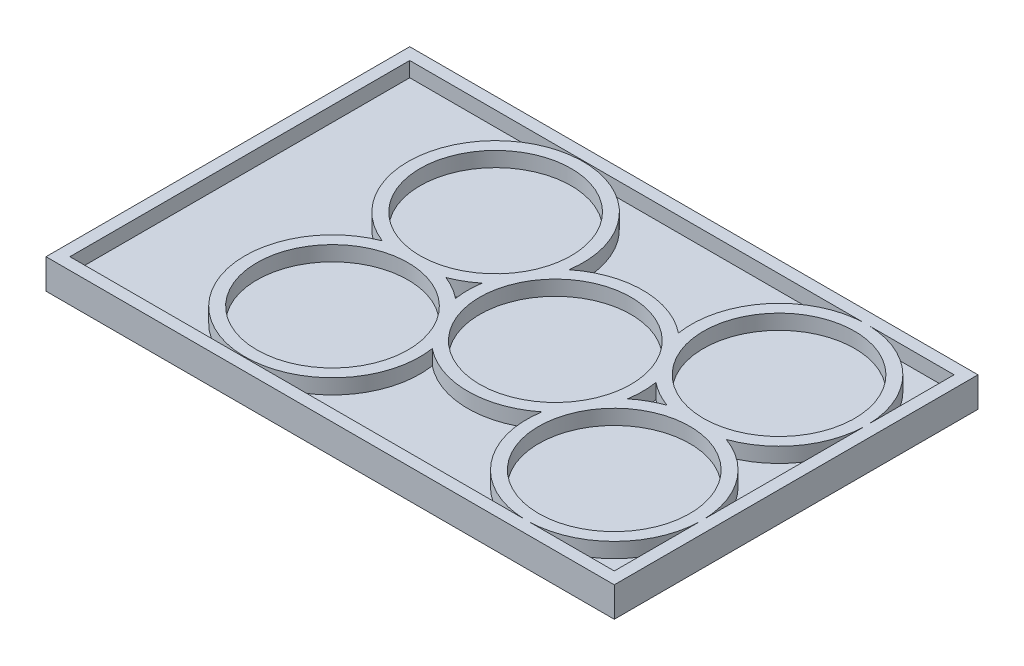
ISO-10303-21;
HEADER;
FILE_DESCRIPTION(('STEP AP214'),'2;1');
FILE_NAME('part.step','',(''),(''),'','','');
FILE_SCHEMA(('AUTOMOTIVE_DESIGN { 1 0 10303 214 1 1 1 1 }'));
ENDSEC;
DATA;
#1=APPLICATION_CONTEXT('core data for automotive mechanical design processes');
#2=APPLICATION_PROTOCOL_DEFINITION('international standard','automotive_design',2000,#1);
#3=PRODUCT_CONTEXT('',#1,'mechanical');
#4=PRODUCT('Part','Part','',(#3));
#5=PRODUCT_RELATED_PRODUCT_CATEGORY('part','',(#4));
#6=PRODUCT_DEFINITION_FORMATION('','',#4);
#7=PRODUCT_DEFINITION_CONTEXT('part definition',#1,'design');
#8=PRODUCT_DEFINITION('design','',#6,#7);
#9=PRODUCT_DEFINITION_SHAPE('','',#8);
#10=(LENGTH_UNIT() NAMED_UNIT(*) SI_UNIT(.MILLI.,.METRE.));
#11=(NAMED_UNIT(*) PLANE_ANGLE_UNIT() SI_UNIT($,.RADIAN.));
#12=(NAMED_UNIT(*) SI_UNIT($,.STERADIAN.) SOLID_ANGLE_UNIT());
#13=UNCERTAINTY_MEASURE_WITH_UNIT(LENGTH_MEASURE(1.E-05),#10,'distance_accuracy_value','');
#14=(GEOMETRIC_REPRESENTATION_CONTEXT(3) GLOBAL_UNCERTAINTY_ASSIGNED_CONTEXT((#13)) GLOBAL_UNIT_ASSIGNED_CONTEXT((#10,
#11,#12)) REPRESENTATION_CONTEXT('',''));
#15=CARTESIAN_POINT('',(0.,0.,0.));
#16=DIRECTION('',(0.,0.,1.));
#17=DIRECTION('',(1.,0.,0.));
#18=AXIS2_PLACEMENT_3D('',#15,#16,#17);
#19=CARTESIAN_POINT('',(0.,2.,0.));
#20=DIRECTION('',(0.,1.,0.));
#21=DIRECTION('',(0.,0.,1.));
#22=AXIS2_PLACEMENT_3D('',#19,#20,#21);
#23=PLANE('',#22);
#24=CARTESIAN_POINT('',(19.5261812499949,2.,-4.37217246100147));
#25=DIRECTION('',(0.,1.,0.));
#26=DIRECTION('',(0.,0.,1.));
#27=AXIS2_PLACEMENT_3D('',#24,#25,#26);
#28=CIRCLE('',#27,11.715);
#29=CARTESIAN_POINT('',(31.2361812499949,2.,-4.71440776017445));
#30=VERTEX_POINT('',#29);
#31=CARTESIAN_POINT('',(23.4873174506323,2.,-15.3971724610015));
#32=VERTEX_POINT('',#31);
#33=EDGE_CURVE('E319',#30,#32,#28,.T.);
#34=ORIENTED_EDGE('',*,*,#33,.F.);
#35=DIRECTION('',(0.,0.,1.));
#36=VECTOR('',#35,1.);
#37=CARTESIAN_POINT('',(31.2361812499949,2.,0.));
#38=LINE('',#37,#36);
#39=CARTESIAN_POINT('',(31.2361812499949,2.,-26.0799371618285));
#40=VERTEX_POINT('',#39);
#41=EDGE_CURVE('E301',#40,#30,#38,.T.);
#42=ORIENTED_EDGE('',*,*,#41,.F.);
#43=CARTESIAN_POINT('',(19.5261812499949,2.,-26.4221724610015));
#44=DIRECTION('',(0.,1.,0.));
#45=DIRECTION('',(0.,0.,1.));
#46=AXIS2_PLACEMENT_3D('',#43,#44,#45);
#47=CIRCLE('',#46,11.715);
#48=EDGE_CURVE('E379',#32,#40,#47,.T.);
#49=ORIENTED_EDGE('',*,*,#48,.F.);
#50=EDGE_LOOP('',(#34,#42,#49));
#51=FACE_BOUND('',#50,.T.);
#52=ADVANCED_FACE('F45',(#51),#23,.T.);
#53=CARTESIAN_POINT('',(31.2361812499949,2.,-38.1321724610015));
#54=VERTEX_POINT('',#53);
#55=CARTESIAN_POINT('',(31.2361812499949,2.,-26.7644077601744));
#56=VERTEX_POINT('',#55);
#57=EDGE_CURVE('E61',#54,#56,#38,.T.);
#58=ORIENTED_EDGE('',*,*,#57,.F.);
#59=DIRECTION('',(1.,0.,0.));
#60=VECTOR('',#59,1.);
#61=CARTESIAN_POINT('',(0.,2.,-38.1321724610015));
#62=LINE('',#61,#60);
#63=CARTESIAN_POINT('',(19.8684165491677,2.,-38.1321724610015));
#64=VERTEX_POINT('',#63);
#65=EDGE_CURVE('E298',#64,#54,#62,.T.);
#66=ORIENTED_EDGE('',*,*,#65,.F.);
#67=EDGE_CURVE('E385',#56,#64,#47,.T.);
#68=ORIENTED_EDGE('',*,*,#67,.F.);
#69=EDGE_LOOP('',(#58,#66,#68));
#70=FACE_BOUND('',#69,.T.);
#71=ADVANCED_FACE('F536',(#70),#23,.T.);
#72=DIRECTION('',(1.,0.,0.));
#73=VECTOR('',#72,1.);
#74=CARTESIAN_POINT('',(0.,2.,7.33782753899853));
#75=LINE('',#74,#73);
#76=CARTESIAN_POINT('',(19.8684165491679,2.,7.33782753899853));
#77=VERTEX_POINT('',#76);
#78=CARTESIAN_POINT('',(31.2361812499949,2.,7.33782753899853));
#79=VERTEX_POINT('',#78);
#80=EDGE_CURVE('E69',#77,#79,#75,.T.);
#81=ORIENTED_EDGE('',*,*,#80,.T.);
#82=CARTESIAN_POINT('',(31.2361812499949,2.,-4.0299371618285));
#83=VERTEX_POINT('',#82);
#84=EDGE_CURVE('E297',#83,#79,#38,.T.);
#85=ORIENTED_EDGE('',*,*,#84,.F.);
#86=EDGE_CURVE('E567',#77,#83,#28,.T.);
#87=ORIENTED_EDGE('',*,*,#86,.F.);
#88=EDGE_LOOP('',(#81,#85,#87));
#89=FACE_BOUND('',#88,.T.);
#90=ADVANCED_FACE('F542',(#89),#23,.T.);
#91=CARTESIAN_POINT('',(19.183945950822,2.,-38.1321724610015));
#92=VERTEX_POINT('',#91);
#93=CARTESIAN_POINT('',(7.96686366574245,2.,-24.5186488897283));
#94=VERTEX_POINT('',#93);
#95=EDGE_CURVE('E391',#92,#94,#47,.T.);
#96=ORIENTED_EDGE('',*,*,#95,.F.);
#97=CARTESIAN_POINT('',(-41.6038187500051,2.,-38.1321724610015));
#98=VERTEX_POINT('',#97);
#99=EDGE_CURVE('E293',#98,#92,#62,.T.);
#100=ORIENTED_EDGE('',*,*,#99,.F.);
#101=DIRECTION('',(0.,0.,1.));
#102=VECTOR('',#101,1.);
#103=CARTESIAN_POINT('',(-41.6038187500051,2.,0.));
#104=LINE('',#103,#102);
#105=CARTESIAN_POINT('',(-41.6038187500051,2.,7.33782753899853));
#106=VERTEX_POINT('',#105);
#107=EDGE_CURVE('E262',#98,#106,#104,.T.);
#108=ORIENTED_EDGE('',*,*,#107,.T.);
#109=CARTESIAN_POINT('',(19.1839459508219,2.,7.33782753899853));
#110=VERTEX_POINT('',#109);
#111=EDGE_CURVE('E265',#106,#110,#75,.T.);
#112=ORIENTED_EDGE('',*,*,#111,.T.);
#113=CARTESIAN_POINT('',(7.96686366574245,2.,-6.27569603227465));
#114=VERTEX_POINT('',#113);
#115=EDGE_CURVE('E381',#114,#110,#28,.T.);
#116=ORIENTED_EDGE('',*,*,#115,.F.);
#117=CARTESIAN_POINT('',(0.615680579994879,2.,-15.3971724610015));
#118=DIRECTION('',(0.,1.,0.));
#119=DIRECTION('',(0.,0.,1.));
#120=AXIS2_PLACEMENT_3D('',#117,#118,#119);
#121=CIRCLE('',#120,11.715);
#122=CARTESIAN_POINT('',(-6.70954692643147,2.,-6.25483867913292));
#123=VERTEX_POINT('',#122);
#124=EDGE_CURVE('E393',#123,#114,#121,.T.);
#125=ORIENTED_EDGE('',*,*,#124,.F.);
#126=CARTESIAN_POINT('',(-18.2896539846195,2.,-4.48217246100158));
#127=DIRECTION('',(0.,1.,0.));
#128=DIRECTION('',(0.,0.,1.));
#129=AXIS2_PLACEMENT_3D('',#126,#127,#128);
#130=CIRCLE('',#129,11.715);
#131=CARTESIAN_POINT('',(-22.5445335363815,2.,-15.3971724610015));
#132=VERTEX_POINT('',#131);
#133=EDGE_CURVE('E396',#132,#123,#130,.T.);
#134=ORIENTED_EDGE('',*,*,#133,.F.);
#135=CARTESIAN_POINT('',(-18.2896539846195,2.,-26.3121724610014));
#136=DIRECTION('',(0.,1.,0.));
#137=DIRECTION('',(0.,0.,1.));
#138=AXIS2_PLACEMENT_3D('',#135,#136,#137);
#139=CIRCLE('',#138,11.715);
#140=CARTESIAN_POINT('',(-6.70954692643146,2.,-24.53950624287));
#141=VERTEX_POINT('',#140);
#142=EDGE_CURVE('E390',#141,#132,#139,.T.);
#143=ORIENTED_EDGE('',*,*,#142,.F.);
#144=EDGE_CURVE('E387',#94,#141,#121,.T.);
#145=ORIENTED_EDGE('',*,*,#144,.F.);
#146=EDGE_LOOP('',(#96,#100,#108,#112,#116,#125,#134,#143,#145));
#147=FACE_BOUND('',#146,.T.);
#148=ADVANCED_FACE('F534',(#147),#23,.T.);
#149=CARTESIAN_POINT('',(0.615680579994879,4.,-15.3971724610015));
#150=DIRECTION('',(0.,-1.,0.));
#151=DIRECTION('',(0.,0.,-1.));
#152=AXIS2_PLACEMENT_3D('',#149,#150,#151);
#153=CYLINDRICAL_SURFACE('',#152,11.715);
#154=CARTESIAN_POINT('',(0.615680579994879,2.,-15.3971724610015));
#155=DIRECTION('',(0.,1.,0.));
#156=DIRECTION('',(0.,0.,1.));
#157=AXIS2_PLACEMENT_3D('',#154,#155,#156);
#158=CIRCLE('',#157,11.715);
#159=CARTESIAN_POINT('',(-10.9644264781931,2.,-17.1698386791328));
#160=VERTEX_POINT('',#159);
#161=CARTESIAN_POINT('',(-10.9644264781931,2.,-13.6245062428701));
#162=VERTEX_POINT('',#161);
#163=EDGE_CURVE('E399',#160,#162,#158,.T.);
#164=ORIENTED_EDGE('',*,*,#163,.T.);
#165=DIRECTION('',(0.,-1.,0.));
#166=VECTOR('',#165,1.);
#167=CARTESIAN_POINT('',(-10.9644264781931,4.,-13.6245062428701));
#168=LINE('',#167,#166);
#169=CARTESIAN_POINT('',(-10.9644264781931,4.,-13.6245062428701));
#170=VERTEX_POINT('',#169);
#171=EDGE_CURVE('E417',#170,#162,#168,.T.);
#172=ORIENTED_EDGE('',*,*,#171,.F.);
#173=CARTESIAN_POINT('',(0.615680579994879,4.,-15.3971724610015));
#174=DIRECTION('',(0.,1.,0.));
#175=DIRECTION('',(0.,0.,1.));
#176=AXIS2_PLACEMENT_3D('',#173,#174,#175);
#177=CIRCLE('',#176,11.715);
#178=CARTESIAN_POINT('',(-10.9644264781931,4.,-17.1698386791328));
#179=VERTEX_POINT('',#178);
#180=EDGE_CURVE('E357',#179,#170,#177,.T.);
#181=ORIENTED_EDGE('',*,*,#180,.F.);
#182=DIRECTION('',(0.,-1.,0.));
#183=VECTOR('',#182,1.);
#184=CARTESIAN_POINT('',(-10.9644264781931,4.,-17.1698386791328));
#185=LINE('',#184,#183);
#186=EDGE_CURVE('E409',#179,#160,#185,.T.);
#187=ORIENTED_EDGE('',*,*,#186,.T.);
#188=EDGE_LOOP('',(#164,#172,#181,#187));
#189=FACE_BOUND('',#188,.T.);
#190=ADVANCED_FACE('F682',(#189),#153,.T.);
#191=CARTESIAN_POINT('',(-18.2896539846195,4.,-4.48217246100158));
#192=DIRECTION('',(0.,-1.,0.));
#193=DIRECTION('',(0.,0.,-1.));
#194=AXIS2_PLACEMENT_3D('',#191,#192,#193);
#195=CYLINDRICAL_SURFACE('',#194,11.715);
#196=CARTESIAN_POINT('',(-18.2896539846195,2.,-4.48217246100158));
#197=DIRECTION('',(0.,1.,0.));
#198=DIRECTION('',(0.,0.,1.));
#199=AXIS2_PLACEMENT_3D('',#196,#197,#198);
#200=CIRCLE('',#199,11.715);
#201=CARTESIAN_POINT('',(-14.0347744328575,2.,-15.3971724610015));
#202=VERTEX_POINT('',#201);
#203=EDGE_CURVE('E403',#162,#202,#200,.T.);
#204=ORIENTED_EDGE('',*,*,#203,.T.);
#205=DIRECTION('',(0.,-1.,0.));
#206=VECTOR('',#205,1.);
#207=CARTESIAN_POINT('',(-14.0347744328575,4.,-15.3971724610015));
#208=LINE('',#207,#206);
#209=CARTESIAN_POINT('',(-14.0347744328575,4.,-15.3971724610015));
#210=VERTEX_POINT('',#209);
#211=EDGE_CURVE('E413',#210,#202,#208,.T.);
#212=ORIENTED_EDGE('',*,*,#211,.F.);
#213=CARTESIAN_POINT('',(-18.2896539846195,4.,-4.48217246100158));
#214=DIRECTION('',(0.,1.,0.));
#215=DIRECTION('',(0.,0.,1.));
#216=AXIS2_PLACEMENT_3D('',#213,#214,#215);
#217=CIRCLE('',#216,11.715);
#218=EDGE_CURVE('E361',#170,#210,#217,.T.);
#219=ORIENTED_EDGE('',*,*,#218,.F.);
#220=ORIENTED_EDGE('',*,*,#171,.T.);
#221=EDGE_LOOP('',(#204,#212,#219,#220));
#222=FACE_BOUND('',#221,.T.);
#223=ADVANCED_FACE('F665',(#222),#195,.T.);
#224=CARTESIAN_POINT('',(19.5261812499949,4.,-26.4221724610015));
#225=DIRECTION('',(0.,-1.,0.));
#226=DIRECTION('',(0.,0.,-1.));
#227=AXIS2_PLACEMENT_3D('',#224,#225,#226);
#228=CYLINDRICAL_SURFACE('',#227,11.715);
#229=CARTESIAN_POINT('',(12.1749981642473,2.,-17.3006960322747));
#230=VERTEX_POINT('',#229);
#231=CARTESIAN_POINT('',(15.5650450493575,2.,-15.3971724610015));
#232=VERTEX_POINT('',#231);
#233=EDGE_CURVE('E386',#230,#232,#47,.T.);
#234=ORIENTED_EDGE('',*,*,#233,.T.);
#235=DIRECTION('',(0.,-1.,0.));
#236=VECTOR('',#235,1.);
#237=CARTESIAN_POINT('',(15.5650450493575,4.,-15.3971724610015));
#238=LINE('',#237,#236);
#239=CARTESIAN_POINT('',(15.5650450493575,4.,-15.3971724610015));
#240=VERTEX_POINT('',#239);
#241=EDGE_CURVE('E414',#240,#232,#238,.T.);
#242=ORIENTED_EDGE('',*,*,#241,.F.);
#243=CARTESIAN_POINT('',(19.5261812499949,4.,-26.4221724610015));
#244=DIRECTION('',(0.,1.,0.));
#245=DIRECTION('',(0.,0.,1.));
#246=AXIS2_PLACEMENT_3D('',#243,#244,#245);
#247=CIRCLE('',#246,11.715);
#248=CARTESIAN_POINT('',(12.1749981642473,4.,-17.3006960322747));
#249=VERTEX_POINT('',#248);
#250=EDGE_CURVE('E331',#249,#240,#247,.T.);
#251=ORIENTED_EDGE('',*,*,#250,.F.);
#252=DIRECTION('',(0.,-1.,0.));
#253=VECTOR('',#252,1.);
#254=CARTESIAN_POINT('',(12.1749981642473,4.,-17.3006960322747));
#255=LINE('',#254,#253);
#256=EDGE_CURVE('E421',#249,#230,#255,.T.);
#257=ORIENTED_EDGE('',*,*,#256,.T.);
#258=EDGE_LOOP('',(#234,#242,#251,#257));
#259=FACE_BOUND('',#258,.T.);
#260=ADVANCED_FACE('F661',(#259),#228,.T.);
#261=CARTESIAN_POINT('',(19.5261812499949,4.,-4.37217246100147));
#262=DIRECTION('',(0.,-1.,0.));
#263=DIRECTION('',(0.,0.,-1.));
#264=AXIS2_PLACEMENT_3D('',#261,#262,#263);
#265=CYLINDRICAL_SURFACE('',#264,11.715);
#266=CARTESIAN_POINT('',(12.1749981642473,2.,-13.4936488897283));
#267=VERTEX_POINT('',#266);
#268=EDGE_CURVE('E380',#232,#267,#28,.T.);
#269=ORIENTED_EDGE('',*,*,#268,.T.);
#270=DIRECTION('',(0.,-1.,0.));
#271=VECTOR('',#270,1.);
#272=CARTESIAN_POINT('',(12.1749981642473,4.,-13.4936488897283));
#273=LINE('',#272,#271);
#274=CARTESIAN_POINT('',(12.1749981642473,4.,-13.4936488897283));
#275=VERTEX_POINT('',#274);
#276=EDGE_CURVE('E425',#275,#267,#273,.T.);
#277=ORIENTED_EDGE('',*,*,#276,.F.);
#278=CARTESIAN_POINT('',(19.5261812499949,4.,-4.37217246100147));
#279=DIRECTION('',(0.,1.,0.));
#280=DIRECTION('',(0.,0.,1.));
#281=AXIS2_PLACEMENT_3D('',#278,#279,#280);
#282=CIRCLE('',#281,11.715);
#283=EDGE_CURVE('E326',#240,#275,#282,.T.);
#284=ORIENTED_EDGE('',*,*,#283,.F.);
#285=ORIENTED_EDGE('',*,*,#241,.T.);
#286=EDGE_LOOP('',(#269,#277,#284,#285));
#287=FACE_BOUND('',#286,.T.);
#288=ADVANCED_FACE('F664',(#287),#265,.T.);
#289=ORIENTED_EDGE('',*,*,#33,.T.);
#290=DIRECTION('',(0.,-1.,0.));
#291=VECTOR('',#290,1.);
#292=CARTESIAN_POINT('',(23.4873174506323,4.,-15.3971724610015));
#293=LINE('',#292,#291);
#294=CARTESIAN_POINT('',(23.4873174506323,4.,-15.3971724610015));
#295=VERTEX_POINT('',#294);
#296=EDGE_CURVE('E426',#295,#32,#293,.T.);
#297=ORIENTED_EDGE('',*,*,#296,.F.);
#298=CARTESIAN_POINT('',(31.2361812499949,4.,-4.71440776017445));
#299=VERTEX_POINT('',#298);
#300=EDGE_CURVE('E320',#299,#295,#282,.T.);
#301=ORIENTED_EDGE('',*,*,#300,.F.);
#302=DIRECTION('',(0.,-1.,0.));
#303=VECTOR('',#302,1.);
#304=CARTESIAN_POINT('',(31.2361812499949,4.,-4.71440776017445));
#305=LINE('',#304,#303);
#306=EDGE_CURVE('E375',#299,#30,#305,.T.);
#307=ORIENTED_EDGE('',*,*,#306,.T.);
#308=EDGE_LOOP('',(#289,#297,#301,#307));
#309=FACE_BOUND('',#308,.T.);
#310=ADVANCED_FACE('F669',(#309),#265,.T.);
#311=ORIENTED_EDGE('',*,*,#48,.T.);
#312=DIRECTION('',(0.,-1.,0.));
#313=VECTOR('',#312,1.);
#314=CARTESIAN_POINT('',(31.2361812499949,4.,-26.0799371618285));
#315=LINE('',#314,#313);
#316=CARTESIAN_POINT('',(31.2361812499949,4.,-26.0799371618285));
#317=VERTEX_POINT('',#316);
#318=EDGE_CURVE('E474',#317,#40,#315,.T.);
#319=ORIENTED_EDGE('',*,*,#318,.F.);
#320=EDGE_CURVE('E324',#295,#317,#247,.T.);
#321=ORIENTED_EDGE('',*,*,#320,.F.);
#322=ORIENTED_EDGE('',*,*,#296,.T.);
#323=EDGE_LOOP('',(#311,#319,#321,#322));
#324=FACE_BOUND('',#323,.T.);
#325=ADVANCED_FACE('F667',(#324),#228,.T.);
#326=ORIENTED_EDGE('',*,*,#67,.T.);
#327=DIRECTION('',(0.,-1.,0.));
#328=VECTOR('',#327,1.);
#329=CARTESIAN_POINT('',(19.8684165491677,4.,-38.1321724610015));
#330=LINE('',#329,#328);
#331=CARTESIAN_POINT('',(19.8684165491677,4.,-38.1321724610015));
#332=VERTEX_POINT('',#331);
#333=EDGE_CURVE('E467',#332,#64,#330,.T.);
#334=ORIENTED_EDGE('',*,*,#333,.F.);
#335=CARTESIAN_POINT('',(31.2361812499949,4.,-26.7644077601744));
#336=VERTEX_POINT('',#335);
#337=EDGE_CURVE('E330',#336,#332,#247,.T.);
#338=ORIENTED_EDGE('',*,*,#337,.F.);
#339=DIRECTION('',(0.,-1.,0.));
#340=VECTOR('',#339,1.);
#341=CARTESIAN_POINT('',(31.2361812499949,4.,-26.7644077601744));
#342=LINE('',#341,#340);
#343=EDGE_CURVE('E471',#336,#56,#342,.T.);
#344=ORIENTED_EDGE('',*,*,#343,.T.);
#345=EDGE_LOOP('',(#326,#334,#338,#344));
#346=FACE_BOUND('',#345,.T.);
#347=ADVANCED_FACE('F621',(#346),#228,.T.);
#348=ORIENTED_EDGE('',*,*,#95,.T.);
#349=DIRECTION('',(0.,-1.,0.));
#350=VECTOR('',#349,1.);
#351=CARTESIAN_POINT('',(7.96686366574245,4.,-24.5186488897283));
#352=LINE('',#351,#350);
#353=CARTESIAN_POINT('',(7.96686366574245,4.,-24.5186488897283));
#354=VERTEX_POINT('',#353);
#355=EDGE_CURVE('E460',#354,#94,#352,.T.);
#356=ORIENTED_EDGE('',*,*,#355,.F.);
#357=CARTESIAN_POINT('',(19.183945950822,4.,-38.1321724610015));
#358=VERTEX_POINT('',#357);
#359=EDGE_CURVE('E336',#358,#354,#247,.T.);
#360=ORIENTED_EDGE('',*,*,#359,.F.);
#361=DIRECTION('',(0.,-1.,0.));
#362=VECTOR('',#361,1.);
#363=CARTESIAN_POINT('',(19.183945950822,4.,-38.1321724610015));
#364=LINE('',#363,#362);
#365=EDGE_CURVE('E464',#358,#92,#364,.T.);
#366=ORIENTED_EDGE('',*,*,#365,.T.);
#367=EDGE_LOOP('',(#348,#356,#360,#366));
#368=FACE_BOUND('',#367,.T.);
#369=ADVANCED_FACE('F633',(#368),#228,.T.);
#370=CARTESIAN_POINT('',(0.615680579994879,4.,-15.3971724610015));
#371=DIRECTION('',(0.,-1.,0.));
#372=DIRECTION('',(0.,0.,-1.));
#373=AXIS2_PLACEMENT_3D('',#370,#371,#372);
#374=CYLINDRICAL_SURFACE('',#373,11.715);
#375=ORIENTED_EDGE('',*,*,#144,.T.);
#376=DIRECTION('',(0.,-1.,0.));
#377=VECTOR('',#376,1.);
#378=CARTESIAN_POINT('',(-6.70954692643146,4.,-24.53950624287));
#379=LINE('',#378,#377);
#380=CARTESIAN_POINT('',(-6.70954692643146,4.,-24.53950624287));
#381=VERTEX_POINT('',#380);
#382=EDGE_CURVE('E456',#381,#141,#379,.T.);
#383=ORIENTED_EDGE('',*,*,#382,.F.);
#384=CARTESIAN_POINT('',(0.615680579994879,4.,-15.3971724610015));
#385=DIRECTION('',(0.,1.,0.));
#386=DIRECTION('',(0.,0.,1.));
#387=AXIS2_PLACEMENT_3D('',#384,#385,#386);
#388=CIRCLE('',#387,11.715);
#389=EDGE_CURVE('E332',#354,#381,#388,.T.);
#390=ORIENTED_EDGE('',*,*,#389,.F.);
#391=ORIENTED_EDGE('',*,*,#355,.T.);
#392=EDGE_LOOP('',(#375,#383,#390,#391));
#393=FACE_BOUND('',#392,.T.);
#394=ADVANCED_FACE('F638',(#393),#374,.T.);
#395=CARTESIAN_POINT('',(-18.2896539846195,4.,-26.3121724610014));
#396=DIRECTION('',(0.,-1.,0.));
#397=DIRECTION('',(0.,0.,-1.));
#398=AXIS2_PLACEMENT_3D('',#395,#396,#397);
#399=CYLINDRICAL_SURFACE('',#398,11.715);
#400=ORIENTED_EDGE('',*,*,#142,.T.);
#401=DIRECTION('',(0.,-1.,0.));
#402=VECTOR('',#401,1.);
#403=CARTESIAN_POINT('',(-22.5445335363815,4.,-15.3971724610015));
#404=LINE('',#403,#402);
#405=CARTESIAN_POINT('',(-22.5445335363815,4.,-15.3971724610015));
#406=VERTEX_POINT('',#405);
#407=EDGE_CURVE('E452',#406,#132,#404,.T.);
#408=ORIENTED_EDGE('',*,*,#407,.F.);
#409=CARTESIAN_POINT('',(-18.2896539846195,4.,-26.3121724610014));
#410=DIRECTION('',(0.,1.,0.));
#411=DIRECTION('',(0.,0.,1.));
#412=AXIS2_PLACEMENT_3D('',#409,#410,#411);
#413=CIRCLE('',#412,11.715);
#414=EDGE_CURVE('E335',#381,#406,#413,.T.);
#415=ORIENTED_EDGE('',*,*,#414,.F.);
#416=ORIENTED_EDGE('',*,*,#382,.T.);
#417=EDGE_LOOP('',(#400,#408,#415,#416));
#418=FACE_BOUND('',#417,.T.);
#419=ADVANCED_FACE('F643',(#418),#399,.T.);
#420=CARTESIAN_POINT('',(-18.2896539846195,4.,-4.48217246100158));
#421=DIRECTION('',(0.,-1.,0.));
#422=DIRECTION('',(0.,0.,-1.));
#423=AXIS2_PLACEMENT_3D('',#420,#421,#422);
#424=CYLINDRICAL_SURFACE('',#423,11.715);
#425=ORIENTED_EDGE('',*,*,#133,.T.);
#426=DIRECTION('',(0.,-1.,0.));
#427=VECTOR('',#426,1.);
#428=CARTESIAN_POINT('',(-6.70954692643147,4.,-6.25483867913292));
#429=LINE('',#428,#427);
#430=CARTESIAN_POINT('',(-6.70954692643147,4.,-6.25483867913292));
#431=VERTEX_POINT('',#430);
#432=EDGE_CURVE('E448',#431,#123,#429,.T.);
#433=ORIENTED_EDGE('',*,*,#432,.F.);
#434=CARTESIAN_POINT('',(-18.2896539846195,4.,-4.48217246100158));
#435=DIRECTION('',(0.,1.,0.));
#436=DIRECTION('',(0.,0.,1.));
#437=AXIS2_PLACEMENT_3D('',#434,#435,#436);
#438=CIRCLE('',#437,11.715);
#439=EDGE_CURVE('E341',#406,#431,#438,.T.);
#440=ORIENTED_EDGE('',*,*,#439,.F.);
#441=ORIENTED_EDGE('',*,*,#407,.T.);
#442=EDGE_LOOP('',(#425,#433,#440,#441));
#443=FACE_BOUND('',#442,.T.);
#444=ADVANCED_FACE('F647',(#443),#424,.T.);
#445=ORIENTED_EDGE('',*,*,#124,.T.);
#446=DIRECTION('',(0.,-1.,0.));
#447=VECTOR('',#446,1.);
#448=CARTESIAN_POINT('',(7.96686366574245,4.,-6.27569603227465));
#449=LINE('',#448,#447);
#450=CARTESIAN_POINT('',(7.96686366574245,4.,-6.27569603227465));
#451=VERTEX_POINT('',#450);
#452=EDGE_CURVE('E444',#451,#114,#449,.T.);
#453=ORIENTED_EDGE('',*,*,#452,.F.);
#454=EDGE_CURVE('E338',#431,#451,#388,.T.);
#455=ORIENTED_EDGE('',*,*,#454,.F.);
#456=ORIENTED_EDGE('',*,*,#432,.T.);
#457=EDGE_LOOP('',(#445,#453,#455,#456));
#458=FACE_BOUND('',#457,.T.);
#459=ADVANCED_FACE('F582',(#458),#374,.T.);
#460=ORIENTED_EDGE('',*,*,#115,.T.);
#461=DIRECTION('',(0.,-1.,0.));
#462=VECTOR('',#461,1.);
#463=CARTESIAN_POINT('',(19.1839459508219,4.,7.33782753899853));
#464=LINE('',#463,#462);
#465=CARTESIAN_POINT('',(19.1839459508219,4.,7.33782753899853));
#466=VERTEX_POINT('',#465);
#467=EDGE_CURVE('E440',#466,#110,#464,.T.);
#468=ORIENTED_EDGE('',*,*,#467,.F.);
#469=EDGE_CURVE('E327',#451,#466,#282,.T.);
#470=ORIENTED_EDGE('',*,*,#469,.F.);
#471=ORIENTED_EDGE('',*,*,#452,.T.);
#472=EDGE_LOOP('',(#460,#468,#470,#471));
#473=FACE_BOUND('',#472,.T.);
#474=ADVANCED_FACE('F588',(#473),#265,.T.);
#475=ORIENTED_EDGE('',*,*,#86,.T.);
#476=DIRECTION('',(0.,-1.,0.));
#477=VECTOR('',#476,1.);
#478=CARTESIAN_POINT('',(31.2361812499949,4.,-4.0299371618285));
#479=LINE('',#478,#477);
#480=CARTESIAN_POINT('',(31.2361812499949,4.,-4.0299371618285));
#481=VERTEX_POINT('',#480);
#482=EDGE_CURVE('E433',#481,#83,#479,.T.);
#483=ORIENTED_EDGE('',*,*,#482,.F.);
#484=CARTESIAN_POINT('',(19.8684165491679,4.,7.33782753899853));
#485=VERTEX_POINT('',#484);
#486=EDGE_CURVE('E348',#485,#481,#282,.T.);
#487=ORIENTED_EDGE('',*,*,#486,.F.);
#488=DIRECTION('',(0.,-1.,0.));
#489=VECTOR('',#488,1.);
#490=CARTESIAN_POINT('',(19.8684165491679,4.,7.33782753899853));
#491=LINE('',#490,#489);
#492=EDGE_CURVE('E437',#485,#77,#491,.T.);
#493=ORIENTED_EDGE('',*,*,#492,.T.);
#494=EDGE_LOOP('',(#475,#483,#487,#493));
#495=FACE_BOUND('',#494,.T.);
#496=ADVANCED_FACE('F670',(#495),#265,.T.);
#497=CARTESIAN_POINT('',(19.5261812499949,4.,-26.4221724610015));
#498=DIRECTION('',(0.,-1.,0.));
#499=DIRECTION('',(0.,0.,-1.));
#500=AXIS2_PLACEMENT_3D('',#497,#498,#499);
#501=CYLINDRICAL_SURFACE('',#500,10.115);
#502=CARTESIAN_POINT('',(19.5261812499949,4.,-26.4221724610015));
#503=DIRECTION('',(0.,1.,0.));
#504=DIRECTION('',(0.,0.,1.));
#505=AXIS2_PLACEMENT_3D('',#502,#503,#504);
#506=CIRCLE('',#505,10.115);
#507=CARTESIAN_POINT('',(19.5261812499949,4.,-16.3071724610015));
#508=VERTEX_POINT('',#507);
#509=EDGE_CURVE('E367',#508,#508,#506,.T.);
#510=ORIENTED_EDGE('',*,*,#509,.T.);
#511=EDGE_LOOP('',(#510));
#512=FACE_BOUND('',#511,.T.);
#513=CARTESIAN_POINT('',(19.5261812499949,2.,-26.4221724610015));
#514=DIRECTION('',(0.,1.,0.));
#515=DIRECTION('',(0.,0.,1.));
#516=AXIS2_PLACEMENT_3D('',#513,#514,#515);
#517=CIRCLE('',#516,10.115);
#518=CARTESIAN_POINT('',(19.5261812499949,2.,-16.3071724610015));
#519=VERTEX_POINT('',#518);
#520=EDGE_CURVE('E11',#519,#519,#517,.F.);
#521=ORIENTED_EDGE('',*,*,#520,.T.);
#522=EDGE_LOOP('',(#521));
#523=FACE_BOUND('',#522,.T.);
#524=ADVANCED_FACE('F691',(#512,#523),#501,.F.);
#525=CARTESIAN_POINT('',(-18.2896539846195,4.,-26.3121724610014));
#526=DIRECTION('',(0.,-1.,0.));
#527=DIRECTION('',(0.,0.,-1.));
#528=AXIS2_PLACEMENT_3D('',#525,#526,#527);
#529=CYLINDRICAL_SURFACE('',#528,11.715);
#530=CARTESIAN_POINT('',(-18.2896539846195,2.,-26.3121724610014));
#531=DIRECTION('',(0.,1.,0.));
#532=DIRECTION('',(0.,0.,1.));
#533=AXIS2_PLACEMENT_3D('',#530,#531,#532);
#534=CIRCLE('',#533,11.715);
#535=EDGE_CURVE('E325',#202,#160,#534,.T.);
#536=ORIENTED_EDGE('',*,*,#535,.T.);
#537=ORIENTED_EDGE('',*,*,#186,.F.);
#538=CARTESIAN_POINT('',(-18.2896539846195,4.,-26.3121724610014));
#539=DIRECTION('',(0.,1.,0.));
#540=DIRECTION('',(0.,0.,1.));
#541=AXIS2_PLACEMENT_3D('',#538,#539,#540);
#542=CIRCLE('',#541,11.715);
#543=EDGE_CURVE('E364',#210,#179,#542,.T.);
#544=ORIENTED_EDGE('',*,*,#543,.F.);
#545=ORIENTED_EDGE('',*,*,#211,.T.);
#546=EDGE_LOOP('',(#536,#537,#544,#545));
#547=FACE_BOUND('',#546,.T.);
#548=ADVANCED_FACE('F680',(#547),#529,.T.);
#549=CARTESIAN_POINT('',(-18.2896539846195,4.,-26.3121724610014));
#550=DIRECTION('',(0.,-1.,0.));
#551=DIRECTION('',(0.,0.,-1.));
#552=AXIS2_PLACEMENT_3D('',#549,#550,#551);
#553=CYLINDRICAL_SURFACE('',#552,10.115);
#554=CARTESIAN_POINT('',(-18.2896539846195,4.,-26.3121724610014));
#555=DIRECTION('',(0.,1.,0.));
#556=DIRECTION('',(0.,0.,1.));
#557=AXIS2_PLACEMENT_3D('',#554,#555,#556);
#558=CIRCLE('',#557,10.115);
#559=CARTESIAN_POINT('',(-18.2896539846195,4.,-16.1971724610014));
#560=VERTEX_POINT('',#559);
#561=EDGE_CURVE('E353',#560,#560,#558,.T.);
#562=ORIENTED_EDGE('',*,*,#561,.T.);
#563=EDGE_LOOP('',(#562));
#564=FACE_BOUND('',#563,.T.);
#565=CARTESIAN_POINT('',(-18.2896539846195,2.,-26.3121724610014));
#566=DIRECTION('',(0.,1.,0.));
#567=DIRECTION('',(0.,0.,1.));
#568=AXIS2_PLACEMENT_3D('',#565,#566,#567);
#569=CIRCLE('',#568,10.115);
#570=CARTESIAN_POINT('',(-18.2896539846195,2.,-16.1971724610014));
#571=VERTEX_POINT('',#570);
#572=EDGE_CURVE('E54',#571,#571,#569,.F.);
#573=ORIENTED_EDGE('',*,*,#572,.T.);
#574=EDGE_LOOP('',(#573));
#575=FACE_BOUND('',#574,.T.);
#576=ADVANCED_FACE('F513',(#564,#575),#553,.F.);
#577=CARTESIAN_POINT('',(0.615680579994879,4.,-15.3971724610015));
#578=DIRECTION('',(0.,-1.,0.));
#579=DIRECTION('',(0.,0.,-1.));
#580=AXIS2_PLACEMENT_3D('',#577,#578,#579);
#581=CYLINDRICAL_SURFACE('',#580,10.115);
#582=CARTESIAN_POINT('',(0.615680579994879,4.,-15.3971724610015));
#583=DIRECTION('',(0.,1.,0.));
#584=DIRECTION('',(0.,0.,1.));
#585=AXIS2_PLACEMENT_3D('',#582,#583,#584);
#586=CIRCLE('',#585,10.115);
#587=CARTESIAN_POINT('',(0.615680579994879,4.,-5.28217246100147));
#588=VERTEX_POINT('',#587);
#589=EDGE_CURVE('E349',#588,#588,#586,.T.);
#590=ORIENTED_EDGE('',*,*,#589,.T.);
#591=EDGE_LOOP('',(#590));
#592=FACE_BOUND('',#591,.T.);
#593=CARTESIAN_POINT('',(0.615680579994879,2.,-15.3971724610015));
#594=DIRECTION('',(0.,1.,0.));
#595=DIRECTION('',(0.,0.,1.));
#596=AXIS2_PLACEMENT_3D('',#593,#594,#595);
#597=CIRCLE('',#596,10.115);
#598=CARTESIAN_POINT('',(0.615680579994879,2.,-5.28217246100147));
#599=VERTEX_POINT('',#598);
#600=EDGE_CURVE('E506',#599,#599,#597,.F.);
#601=ORIENTED_EDGE('',*,*,#600,.T.);
#602=EDGE_LOOP('',(#601));
#603=FACE_BOUND('',#602,.T.);
#604=ADVANCED_FACE('F673',(#592,#603),#581,.F.);
#605=EDGE_CURVE('E392',#267,#230,#121,.T.);
#606=ORIENTED_EDGE('',*,*,#605,.T.);
#607=ORIENTED_EDGE('',*,*,#256,.F.);
#608=EDGE_CURVE('E337',#275,#249,#388,.T.);
#609=ORIENTED_EDGE('',*,*,#608,.F.);
#610=ORIENTED_EDGE('',*,*,#276,.T.);
#611=EDGE_LOOP('',(#606,#607,#609,#610));
#612=FACE_BOUND('',#611,.T.);
#613=ADVANCED_FACE('F655',(#612),#374,.T.);
#614=CARTESIAN_POINT('',(-18.2896539846195,4.,-4.48217246100158));
#615=DIRECTION('',(0.,-1.,0.));
#616=DIRECTION('',(0.,0.,-1.));
#617=AXIS2_PLACEMENT_3D('',#614,#615,#616);
#618=CYLINDRICAL_SURFACE('',#617,10.115);
#619=CARTESIAN_POINT('',(-18.2896539846195,4.,-4.48217246100158));
#620=DIRECTION('',(0.,1.,0.));
#621=DIRECTION('',(0.,0.,1.));
#622=AXIS2_PLACEMENT_3D('',#619,#620,#621);
#623=CIRCLE('',#622,10.115);
#624=CARTESIAN_POINT('',(-18.2896539846195,4.,5.63282753899842));
#625=VERTEX_POINT('',#624);
#626=EDGE_CURVE('E344',#625,#625,#623,.T.);
#627=ORIENTED_EDGE('',*,*,#626,.T.);
#628=EDGE_LOOP('',(#627));
#629=FACE_BOUND('',#628,.T.);
#630=CARTESIAN_POINT('',(-18.2896539846195,2.,-4.48217246100158));
#631=DIRECTION('',(0.,1.,0.));
#632=DIRECTION('',(0.,0.,1.));
#633=AXIS2_PLACEMENT_3D('',#630,#631,#632);
#634=CIRCLE('',#633,10.115);
#635=CARTESIAN_POINT('',(-18.2896539846195,2.,5.63282753899842));
#636=VERTEX_POINT('',#635);
#637=EDGE_CURVE('E502',#636,#636,#634,.F.);
#638=ORIENTED_EDGE('',*,*,#637,.T.);
#639=EDGE_LOOP('',(#638));
#640=FACE_BOUND('',#639,.T.);
#641=ADVANCED_FACE('F657',(#629,#640),#618,.F.);
#642=CARTESIAN_POINT('',(19.5261812499949,4.,-4.37217246100147));
#643=DIRECTION('',(0.,-1.,0.));
#644=DIRECTION('',(0.,0.,-1.));
#645=AXIS2_PLACEMENT_3D('',#642,#643,#644);
#646=CYLINDRICAL_SURFACE('',#645,10.115);
#647=CARTESIAN_POINT('',(19.5261812499949,4.,-4.37217246100147));
#648=DIRECTION('',(0.,1.,0.));
#649=DIRECTION('',(0.,0.,1.));
#650=AXIS2_PLACEMENT_3D('',#647,#648,#649);
#651=CIRCLE('',#650,10.115);
#652=CARTESIAN_POINT('',(19.5261812499949,4.,5.74282753899853));
#653=VERTEX_POINT('',#652);
#654=EDGE_CURVE('E371',#653,#653,#651,.T.);
#655=ORIENTED_EDGE('',*,*,#654,.T.);
#656=EDGE_LOOP('',(#655));
#657=FACE_BOUND('',#656,.T.);
#658=CARTESIAN_POINT('',(19.5261812499949,2.,-4.37217246100147));
#659=DIRECTION('',(0.,1.,0.));
#660=DIRECTION('',(0.,0.,1.));
#661=AXIS2_PLACEMENT_3D('',#658,#659,#660);
#662=CIRCLE('',#661,10.115);
#663=CARTESIAN_POINT('',(19.5261812499949,2.,5.74282753899853));
#664=VERTEX_POINT('',#663);
#665=EDGE_CURVE('E498',#664,#664,#662,.F.);
#666=ORIENTED_EDGE('',*,*,#665,.T.);
#667=EDGE_LOOP('',(#666));
#668=FACE_BOUND('',#667,.T.);
#669=ADVANCED_FACE('F551',(#657,#668),#646,.F.);
#670=CARTESIAN_POINT('',(0.,4.,0.));
#671=DIRECTION('',(0.,1.,0.));
#672=DIRECTION('',(0.,0.,1.));
#673=AXIS2_PLACEMENT_3D('',#670,#671,#672);
#674=PLANE('',#673);
#675=DIRECTION('',(1.,0.,0.));
#676=VECTOR('',#675,1.);
#677=CARTESIAN_POINT('',(0.,4.,-38.1321724610015));
#678=LINE('',#677,#676);
#679=CARTESIAN_POINT('',(-41.6038187500051,4.,-38.1321724610015));
#680=VERTEX_POINT('',#679);
#681=EDGE_CURVE('E273',#680,#358,#678,.T.);
#682=ORIENTED_EDGE('',*,*,#681,.T.);
#683=ORIENTED_EDGE('',*,*,#359,.T.);
#684=ORIENTED_EDGE('',*,*,#389,.T.);
#685=ORIENTED_EDGE('',*,*,#414,.T.);
#686=ORIENTED_EDGE('',*,*,#439,.T.);
#687=ORIENTED_EDGE('',*,*,#454,.T.);
#688=ORIENTED_EDGE('',*,*,#469,.T.);
#689=DIRECTION('',(1.,0.,0.));
#690=VECTOR('',#689,1.);
#691=CARTESIAN_POINT('',(0.,4.,7.33782753899853));
#692=LINE('',#691,#690);
#693=CARTESIAN_POINT('',(-41.6038187500051,4.,7.33782753899853));
#694=VERTEX_POINT('',#693);
#695=EDGE_CURVE('E284',#694,#466,#692,.T.);
#696=ORIENTED_EDGE('',*,*,#695,.F.);
#697=DIRECTION('',(0.,0.,1.));
#698=VECTOR('',#697,1.);
#699=CARTESIAN_POINT('',(-41.6038187500051,4.,0.));
#700=LINE('',#699,#698);
#701=EDGE_CURVE('E288',#680,#694,#700,.T.);
#702=ORIENTED_EDGE('',*,*,#701,.F.);
#703=EDGE_LOOP('',(#682,#683,#684,#685,#686,#687,#688,#696,#702));
#704=FACE_BOUND('',#703,.T.);
#705=DIRECTION('',(0.,0.,1.));
#706=VECTOR('',#705,1.);
#707=CARTESIAN_POINT('',(31.2361812499949,4.,0.));
#708=LINE('',#707,#706);
#709=EDGE_CURVE('E283',#317,#299,#708,.T.);
#710=ORIENTED_EDGE('',*,*,#709,.T.);
#711=ORIENTED_EDGE('',*,*,#300,.T.);
#712=ORIENTED_EDGE('',*,*,#320,.T.);
#713=EDGE_LOOP('',(#710,#711,#712));
#714=FACE_BOUND('',#713,.T.);
#715=CARTESIAN_POINT('',(31.2361812499949,4.,-38.1321724610015));
#716=VERTEX_POINT('',#715);
#717=EDGE_CURVE('E278',#716,#336,#708,.T.);
#718=ORIENTED_EDGE('',*,*,#717,.T.);
#719=ORIENTED_EDGE('',*,*,#337,.T.);
#720=EDGE_CURVE('E272',#332,#716,#678,.T.);
#721=ORIENTED_EDGE('',*,*,#720,.T.);
#722=EDGE_LOOP('',(#718,#719,#721));
#723=FACE_BOUND('',#722,.T.);
#724=ORIENTED_EDGE('',*,*,#486,.T.);
#725=CARTESIAN_POINT('',(31.2361812499949,4.,7.33782753899853));
#726=VERTEX_POINT('',#725);
#727=EDGE_CURVE('E277',#481,#726,#708,.T.);
#728=ORIENTED_EDGE('',*,*,#727,.T.);
#729=EDGE_CURVE('E282',#485,#726,#692,.T.);
#730=ORIENTED_EDGE('',*,*,#729,.F.);
#731=EDGE_LOOP('',(#724,#728,#730));
#732=FACE_BOUND('',#731,.T.);
#733=ORIENTED_EDGE('',*,*,#626,.F.);
#734=EDGE_LOOP('',(#733));
#735=FACE_BOUND('',#734,.T.);
#736=ORIENTED_EDGE('',*,*,#250,.T.);
#737=ORIENTED_EDGE('',*,*,#283,.T.);
#738=ORIENTED_EDGE('',*,*,#608,.T.);
#739=EDGE_LOOP('',(#736,#737,#738));
#740=FACE_BOUND('',#739,.T.);
#741=ORIENTED_EDGE('',*,*,#589,.F.);
#742=EDGE_LOOP('',(#741));
#743=FACE_BOUND('',#742,.T.);
#744=ORIENTED_EDGE('',*,*,#561,.F.);
#745=EDGE_LOOP('',(#744));
#746=FACE_BOUND('',#745,.T.);
#747=ORIENTED_EDGE('',*,*,#180,.T.);
#748=ORIENTED_EDGE('',*,*,#218,.T.);
#749=ORIENTED_EDGE('',*,*,#543,.T.);
#750=EDGE_LOOP('',(#747,#748,#749));
#751=FACE_BOUND('',#750,.T.);
#752=ORIENTED_EDGE('',*,*,#509,.F.);
#753=EDGE_LOOP('',(#752));
#754=FACE_BOUND('',#753,.T.);
#755=ORIENTED_EDGE('',*,*,#654,.F.);
#756=EDGE_LOOP('',(#755));
#757=FACE_BOUND('',#756,.T.);
#758=DIRECTION('',(-1.,0.,0.));
#759=VECTOR('',#758,1.);
#760=CARTESIAN_POINT('',(0.,4.,-39.7321724610015));
#761=LINE('',#760,#759);
#762=CARTESIAN_POINT('',(32.8361812499949,4.,-39.7321724610015));
#763=VERTEX_POINT('',#762);
#764=CARTESIAN_POINT('',(-43.2038187500051,4.,-39.7321724610015));
#765=VERTEX_POINT('',#764);
#766=EDGE_CURVE('E238',#763,#765,#761,.T.);
#767=ORIENTED_EDGE('',*,*,#766,.T.);
#768=DIRECTION('',(0.,0.,1.));
#769=VECTOR('',#768,1.);
#770=CARTESIAN_POINT('',(-43.2038187500051,4.,0.));
#771=LINE('',#770,#769);
#772=CARTESIAN_POINT('',(-43.2038187500051,4.,8.93782753899853));
#773=VERTEX_POINT('',#772);
#774=EDGE_CURVE('E248',#765,#773,#771,.T.);
#775=ORIENTED_EDGE('',*,*,#774,.T.);
#776=DIRECTION('',(1.,0.,0.));
#777=VECTOR('',#776,1.);
#778=CARTESIAN_POINT('',(0.,4.,8.93782753899853));
#779=LINE('',#778,#777);
#780=CARTESIAN_POINT('',(32.8361812499949,4.,8.93782753899853));
#781=VERTEX_POINT('',#780);
#782=EDGE_CURVE('E255',#773,#781,#779,.T.);
#783=ORIENTED_EDGE('',*,*,#782,.T.);
#784=DIRECTION('',(0.,0.,-1.));
#785=VECTOR('',#784,1.);
#786=CARTESIAN_POINT('',(32.8361812499949,4.,0.));
#787=LINE('',#786,#785);
#788=EDGE_CURVE('E260',#781,#763,#787,.T.);
#789=ORIENTED_EDGE('',*,*,#788,.T.);
#790=EDGE_LOOP('',(#767,#775,#783,#789));
#791=FACE_BOUND('',#790,.T.);
#792=ADVANCED_FACE('F258',(#704,#714,#723,#732,#735,#740,#743,#746,#751,#754,#757,#791),#674,.T.);
#793=ORIENTED_EDGE('',*,*,#665,.F.);
#794=EDGE_LOOP('',(#793));
#795=FACE_BOUND('',#794,.T.);
#796=ADVANCED_FACE('F538',(#795),#23,.T.);
#797=ORIENTED_EDGE('',*,*,#637,.F.);
#798=EDGE_LOOP('',(#797));
#799=FACE_BOUND('',#798,.T.);
#800=ADVANCED_FACE('F526',(#799),#23,.T.);
#801=ORIENTED_EDGE('',*,*,#268,.F.);
#802=ORIENTED_EDGE('',*,*,#233,.F.);
#803=ORIENTED_EDGE('',*,*,#605,.F.);
#804=EDGE_LOOP('',(#801,#802,#803));
#805=FACE_BOUND('',#804,.T.);
#806=ADVANCED_FACE('F527',(#805),#23,.T.);
#807=ORIENTED_EDGE('',*,*,#600,.F.);
#808=EDGE_LOOP('',(#807));
#809=FACE_BOUND('',#808,.T.);
#810=ADVANCED_FACE('F518',(#809),#23,.T.);
#811=ORIENTED_EDGE('',*,*,#572,.F.);
#812=EDGE_LOOP('',(#811));
#813=FACE_BOUND('',#812,.T.);
#814=ADVANCED_FACE('F515',(#813),#23,.T.);
#815=ORIENTED_EDGE('',*,*,#203,.F.);
#816=ORIENTED_EDGE('',*,*,#163,.F.);
#817=ORIENTED_EDGE('',*,*,#535,.F.);
#818=EDGE_LOOP('',(#815,#816,#817));
#819=FACE_BOUND('',#818,.T.);
#820=ADVANCED_FACE('F517',(#819),#23,.T.);
#821=ORIENTED_EDGE('',*,*,#520,.F.);
#822=EDGE_LOOP('',(#821));
#823=FACE_BOUND('',#822,.T.);
#824=ADVANCED_FACE('F520',(#823),#23,.T.);
#825=CARTESIAN_POINT('',(0.,4.,-38.1321724610015));
#826=DIRECTION('',(0.,0.,-1.));
#827=DIRECTION('',(-1.,0.,0.));
#828=AXIS2_PLACEMENT_3D('',#825,#826,#827);
#829=PLANE('',#828);
#830=ORIENTED_EDGE('',*,*,#720,.F.);
#831=ORIENTED_EDGE('',*,*,#333,.T.);
#832=ORIENTED_EDGE('',*,*,#65,.T.);
#833=DIRECTION('',(0.,-1.,0.));
#834=VECTOR('',#833,1.);
#835=CARTESIAN_POINT('',(31.2361812499949,4.,-38.1321724610015));
#836=LINE('',#835,#834);
#837=EDGE_CURVE('E315',#716,#54,#836,.T.);
#838=ORIENTED_EDGE('',*,*,#837,.F.);
#839=EDGE_LOOP('',(#830,#831,#832,#838));
#840=FACE_BOUND('',#839,.T.);
#841=ADVANCED_FACE('F532',(#840),#829,.F.);
#842=ORIENTED_EDGE('',*,*,#99,.T.);
#843=ORIENTED_EDGE('',*,*,#365,.F.);
#844=ORIENTED_EDGE('',*,*,#681,.F.);
#845=DIRECTION('',(0.,-1.,0.));
#846=VECTOR('',#845,1.);
#847=CARTESIAN_POINT('',(-41.6038187500051,4.,-38.1321724610015));
#848=LINE('',#847,#846);
#849=EDGE_CURVE('E292',#680,#98,#848,.T.);
#850=ORIENTED_EDGE('',*,*,#849,.T.);
#851=EDGE_LOOP('',(#842,#843,#844,#850));
#852=FACE_BOUND('',#851,.T.);
#853=ADVANCED_FACE('F701',(#852),#829,.F.);
#854=CARTESIAN_POINT('',(31.2361812499949,4.,0.));
#855=DIRECTION('',(1.,0.,0.));
#856=DIRECTION('',(0.,0.,-1.));
#857=AXIS2_PLACEMENT_3D('',#854,#855,#856);
#858=PLANE('',#857);
#859=ORIENTED_EDGE('',*,*,#41,.T.);
#860=ORIENTED_EDGE('',*,*,#306,.F.);
#861=ORIENTED_EDGE('',*,*,#709,.F.);
#862=ORIENTED_EDGE('',*,*,#318,.T.);
#863=EDGE_LOOP('',(#859,#860,#861,#862));
#864=FACE_BOUND('',#863,.T.);
#865=ADVANCED_FACE('F702',(#864),#858,.F.);
#866=ORIENTED_EDGE('',*,*,#57,.T.);
#867=ORIENTED_EDGE('',*,*,#343,.F.);
#868=ORIENTED_EDGE('',*,*,#717,.F.);
#869=ORIENTED_EDGE('',*,*,#837,.T.);
#870=EDGE_LOOP('',(#866,#867,#868,#869));
#871=FACE_BOUND('',#870,.T.);
#872=ADVANCED_FACE('F705',(#871),#858,.F.);
#873=ORIENTED_EDGE('',*,*,#727,.F.);
#874=ORIENTED_EDGE('',*,*,#482,.T.);
#875=ORIENTED_EDGE('',*,*,#84,.T.);
#876=DIRECTION('',(0.,-1.,0.));
#877=VECTOR('',#876,1.);
#878=CARTESIAN_POINT('',(31.2361812499949,4.,7.33782753899853));
#879=LINE('',#878,#877);
#880=EDGE_CURVE('E311',#726,#79,#879,.T.);
#881=ORIENTED_EDGE('',*,*,#880,.F.);
#882=EDGE_LOOP('',(#873,#874,#875,#881));
#883=FACE_BOUND('',#882,.T.);
#884=ADVANCED_FACE('F707',(#883),#858,.F.);
#885=CARTESIAN_POINT('',(0.,4.,7.33782753899853));
#886=DIRECTION('',(0.,0.,-1.));
#887=DIRECTION('',(-1.,0.,0.));
#888=AXIS2_PLACEMENT_3D('',#885,#886,#887);
#889=PLANE('',#888);
#890=ORIENTED_EDGE('',*,*,#467,.T.);
#891=ORIENTED_EDGE('',*,*,#111,.F.);
#892=DIRECTION('',(0.,-1.,0.));
#893=VECTOR('',#892,1.);
#894=CARTESIAN_POINT('',(-41.6038187500051,4.,7.33782753899853));
#895=LINE('',#894,#893);
#896=EDGE_CURVE('E307',#694,#106,#895,.T.);
#897=ORIENTED_EDGE('',*,*,#896,.F.);
#898=ORIENTED_EDGE('',*,*,#695,.T.);
#899=EDGE_LOOP('',(#890,#891,#897,#898));
#900=FACE_BOUND('',#899,.T.);
#901=ADVANCED_FACE('F594',(#900),#889,.T.);
#902=ORIENTED_EDGE('',*,*,#492,.F.);
#903=ORIENTED_EDGE('',*,*,#729,.T.);
#904=ORIENTED_EDGE('',*,*,#880,.T.);
#905=ORIENTED_EDGE('',*,*,#80,.F.);
#906=EDGE_LOOP('',(#902,#903,#904,#905));
#907=FACE_BOUND('',#906,.T.);
#908=ADVANCED_FACE('F710',(#907),#889,.T.);
#909=CARTESIAN_POINT('',(-41.6038187500051,4.,0.));
#910=DIRECTION('',(1.,0.,0.));
#911=DIRECTION('',(0.,0.,-1.));
#912=AXIS2_PLACEMENT_3D('',#909,#910,#911);
#913=PLANE('',#912);
#914=ORIENTED_EDGE('',*,*,#107,.F.);
#915=ORIENTED_EDGE('',*,*,#849,.F.);
#916=ORIENTED_EDGE('',*,*,#701,.T.);
#917=ORIENTED_EDGE('',*,*,#896,.T.);
#918=EDGE_LOOP('',(#914,#915,#916,#917));
#919=FACE_BOUND('',#918,.T.);
#920=ADVANCED_FACE('F711',(#919),#913,.T.);
#921=CARTESIAN_POINT('',(0.,0.,0.));
#922=DIRECTION('',(0.,1.,0.));
#923=DIRECTION('',(0.,0.,1.));
#924=AXIS2_PLACEMENT_3D('',#921,#922,#923);
#925=PLANE('',#924);
#926=DIRECTION('',(0.,0.,1.));
#927=VECTOR('',#926,1.);
#928=CARTESIAN_POINT('',(-43.2038187500051,0.,-39.7321724610015));
#929=LINE('',#928,#927);
#930=CARTESIAN_POINT('',(-43.2038187500051,0.,-39.7321724610015));
#931=VERTEX_POINT('',#930);
#932=CARTESIAN_POINT('',(-43.2038187500051,0.,8.93782753899853));
#933=VERTEX_POINT('',#932);
#934=EDGE_CURVE('E420',#931,#933,#929,.T.);
#935=ORIENTED_EDGE('',*,*,#934,.F.);
#936=DIRECTION('',(-1.,0.,0.));
#937=VECTOR('',#936,1.);
#938=CARTESIAN_POINT('',(-43.2038187500051,0.,-39.7321724610015));
#939=LINE('',#938,#937);
#940=CARTESIAN_POINT('',(32.8361812499949,0.,-39.7321724610015));
#941=VERTEX_POINT('',#940);
#942=EDGE_CURVE('E240',#941,#931,#939,.T.);
#943=ORIENTED_EDGE('',*,*,#942,.F.);
#944=DIRECTION('',(0.,0.,-1.));
#945=VECTOR('',#944,1.);
#946=CARTESIAN_POINT('',(32.8361812499949,0.,-39.7321724610015));
#947=LINE('',#946,#945);
#948=CARTESIAN_POINT('',(32.8361812499949,0.,8.93782753899853));
#949=VERTEX_POINT('',#948);
#950=EDGE_CURVE('E485',#949,#941,#947,.T.);
#951=ORIENTED_EDGE('',*,*,#950,.F.);
#952=DIRECTION('',(1.,0.,0.));
#953=VECTOR('',#952,1.);
#954=CARTESIAN_POINT('',(-43.2038187500051,0.,8.93782753899853));
#955=LINE('',#954,#953);
#956=EDGE_CURVE('E482',#933,#949,#955,.T.);
#957=ORIENTED_EDGE('',*,*,#956,.F.);
#958=EDGE_LOOP('',(#935,#943,#951,#957));
#959=FACE_BOUND('',#958,.T.);
#960=ADVANCED_FACE('F713',(#959),#925,.F.);
#961=CARTESIAN_POINT('',(32.8361812499949,2.,-39.7321724610015));
#962=DIRECTION('',(-1.,0.,0.));
#963=DIRECTION('',(0.,0.,1.));
#964=AXIS2_PLACEMENT_3D('',#961,#962,#963);
#965=PLANE('',#964);
#966=ORIENTED_EDGE('',*,*,#950,.T.);
#967=DIRECTION('',(0.,-1.,0.));
#968=VECTOR('',#967,1.);
#969=CARTESIAN_POINT('',(32.8361812499949,2.,-39.7321724610015));
#970=LINE('',#969,#968);
#971=EDGE_CURVE('E245',#763,#941,#970,.T.);
#972=ORIENTED_EDGE('',*,*,#971,.F.);
#973=ORIENTED_EDGE('',*,*,#788,.F.);
#974=DIRECTION('',(0.,-1.,0.));
#975=VECTOR('',#974,1.);
#976=CARTESIAN_POINT('',(32.8361812499949,2.,8.93782753899853));
#977=LINE('',#976,#975);
#978=EDGE_CURVE('E492',#781,#949,#977,.T.);
#979=ORIENTED_EDGE('',*,*,#978,.T.);
#980=EDGE_LOOP('',(#966,#972,#973,#979));
#981=FACE_BOUND('',#980,.T.);
#982=ADVANCED_FACE('F719',(#981),#965,.F.);
#983=CARTESIAN_POINT('',(-43.2038187500051,2.,8.93782753899853));
#984=DIRECTION('',(0.,0.,-1.));
#985=DIRECTION('',(-1.,0.,0.));
#986=AXIS2_PLACEMENT_3D('',#983,#984,#985);
#987=PLANE('',#986);
#988=ORIENTED_EDGE('',*,*,#956,.T.);
#989=ORIENTED_EDGE('',*,*,#978,.F.);
#990=ORIENTED_EDGE('',*,*,#782,.F.);
#991=DIRECTION('',(0.,-1.,0.));
#992=VECTOR('',#991,1.);
#993=CARTESIAN_POINT('',(-43.2038187500051,2.,8.93782753899853));
#994=LINE('',#993,#992);
#995=EDGE_CURVE('E250',#773,#933,#994,.T.);
#996=ORIENTED_EDGE('',*,*,#995,.T.);
#997=EDGE_LOOP('',(#988,#989,#990,#996));
#998=FACE_BOUND('',#997,.T.);
#999=ADVANCED_FACE('F769',(#998),#987,.F.);
#1000=CARTESIAN_POINT('',(-43.2038187500051,2.,-39.7321724610015));
#1001=DIRECTION('',(1.,0.,0.));
#1002=DIRECTION('',(0.,0.,-1.));
#1003=AXIS2_PLACEMENT_3D('',#1000,#1001,#1002);
#1004=PLANE('',#1003);
#1005=ORIENTED_EDGE('',*,*,#934,.T.);
#1006=ORIENTED_EDGE('',*,*,#995,.F.);
#1007=ORIENTED_EDGE('',*,*,#774,.F.);
#1008=DIRECTION('',(0.,-1.,0.));
#1009=VECTOR('',#1008,1.);
#1010=CARTESIAN_POINT('',(-43.2038187500051,2.,-39.7321724610015));
#1011=LINE('',#1010,#1009);
#1012=EDGE_CURVE('E233',#765,#931,#1011,.T.);
#1013=ORIENTED_EDGE('',*,*,#1012,.T.);
#1014=EDGE_LOOP('',(#1005,#1006,#1007,#1013));
#1015=FACE_BOUND('',#1014,.T.);
#1016=ADVANCED_FACE('F47',(#1015),#1004,.F.);
#1017=CARTESIAN_POINT('',(-43.2038187500051,2.,-39.7321724610015));
#1018=DIRECTION('',(0.,0.,1.));
#1019=DIRECTION('',(1.,0.,0.));
#1020=AXIS2_PLACEMENT_3D('',#1017,#1018,#1019);
#1021=PLANE('',#1020);
#1022=ORIENTED_EDGE('',*,*,#942,.T.);
#1023=ORIENTED_EDGE('',*,*,#1012,.F.);
#1024=ORIENTED_EDGE('',*,*,#766,.F.);
#1025=ORIENTED_EDGE('',*,*,#971,.T.);
#1026=EDGE_LOOP('',(#1022,#1023,#1024,#1025));
#1027=FACE_BOUND('',#1026,.T.);
#1028=ADVANCED_FACE('F235',(#1027),#1021,.F.);
#1029=CLOSED_SHELL('',(#52,#71,#90,#148,#190,#223,#260,#288,#310,#325,#347,#369,#394,#419,#444,
#459,#474,#496,#524,#548,#576,#604,#613,#641,#669,#792,#796,#800,#806,#810,#814,#820,#824,#841,
#853,#865,#872,#884,#901,#908,#920,#960,#982,#999,#1016,#1028));
#1030=MANIFOLD_SOLID_BREP('B2',#1029);
#1031=ADVANCED_BREP_SHAPE_REPRESENTATION('',(#18,#1030),#14);
#1032=SHAPE_DEFINITION_REPRESENTATION(#9,#1031);
ENDSEC;
END-ISO-10303-21;
